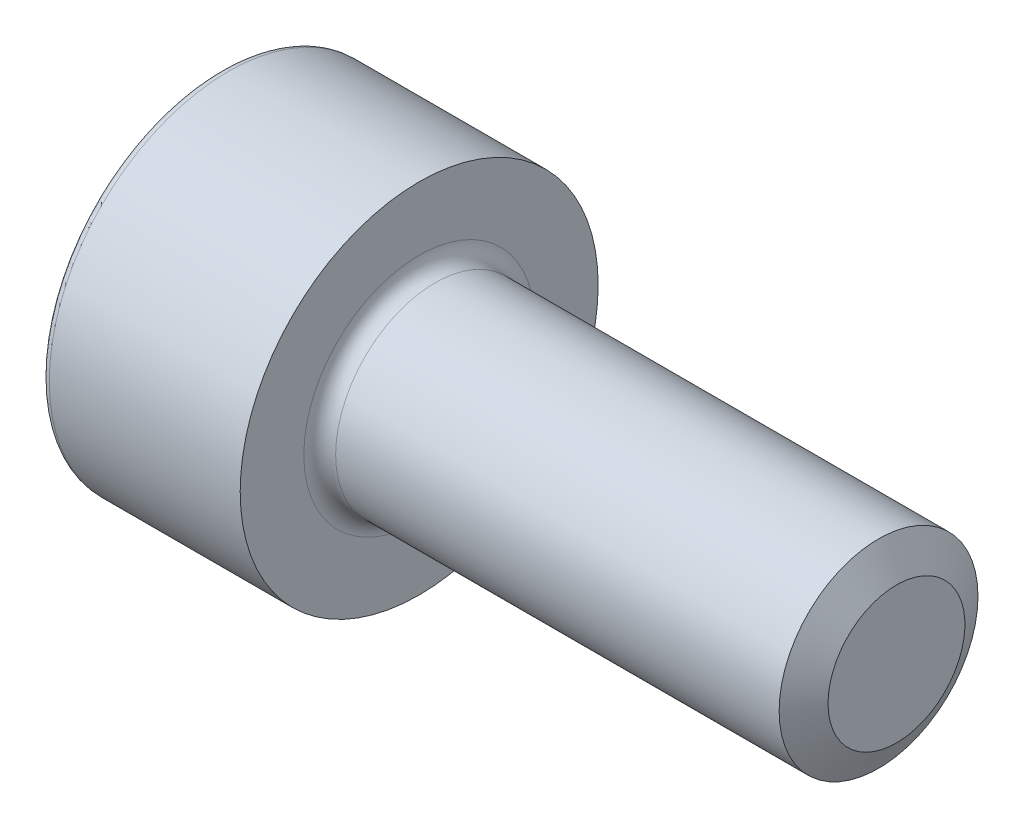
ISO-10303-21;
HEADER;
FILE_DESCRIPTION(('STEP AP214'),'2;1');
FILE_NAME('part.step','',(''),(''),'','','');
FILE_SCHEMA(('AUTOMOTIVE_DESIGN { 1 0 10303 214 1 1 1 1 }'));
ENDSEC;
DATA;
#1=APPLICATION_CONTEXT('core data for automotive mechanical design processes');
#2=APPLICATION_PROTOCOL_DEFINITION('international standard','automotive_design',2000,#1);
#3=PRODUCT_CONTEXT('',#1,'mechanical');
#4=PRODUCT('Part','Part','',(#3));
#5=PRODUCT_RELATED_PRODUCT_CATEGORY('part','',(#4));
#6=PRODUCT_DEFINITION_FORMATION('','',#4);
#7=PRODUCT_DEFINITION_CONTEXT('part definition',#1,'design');
#8=PRODUCT_DEFINITION('design','',#6,#7);
#9=PRODUCT_DEFINITION_SHAPE('','',#8);
#10=(LENGTH_UNIT() NAMED_UNIT(*) SI_UNIT(.MILLI.,.METRE.));
#11=(NAMED_UNIT(*) PLANE_ANGLE_UNIT() SI_UNIT($,.RADIAN.));
#12=(NAMED_UNIT(*) SI_UNIT($,.STERADIAN.) SOLID_ANGLE_UNIT());
#13=UNCERTAINTY_MEASURE_WITH_UNIT(LENGTH_MEASURE(1.E-05),#10,'distance_accuracy_value','');
#14=(GEOMETRIC_REPRESENTATION_CONTEXT(3) GLOBAL_UNCERTAINTY_ASSIGNED_CONTEXT((#13)) GLOBAL_UNIT_ASSIGNED_CONTEXT((#10,
#11,#12)) REPRESENTATION_CONTEXT('',''));
#15=CARTESIAN_POINT('',(0.,0.,0.));
#16=DIRECTION('',(0.,0.,1.));
#17=DIRECTION('',(1.,0.,0.));
#18=AXIS2_PLACEMENT_3D('',#15,#16,#17);
#19=CARTESIAN_POINT('',(0.,0.,0.));
#20=DIRECTION('',(-1.,0.,0.));
#21=DIRECTION('',(0.,0.,1.));
#22=AXIS2_PLACEMENT_3D('',#19,#20,#21);
#23=CYLINDRICAL_SURFACE('',#22,1.25);
#24=CARTESIAN_POINT('',(2.7,0.,0.));
#25=DIRECTION('',(-1.,0.,0.));
#26=DIRECTION('',(0.,0.,1.));
#27=AXIS2_PLACEMENT_3D('',#24,#25,#26);
#28=CIRCLE('',#27,1.25);
#29=CARTESIAN_POINT('',(2.7,0.,1.25));
#30=VERTEX_POINT('',#29);
#31=EDGE_CURVE('E144',#30,#30,#28,.T.);
#32=ORIENTED_EDGE('',*,*,#31,.F.);
#33=EDGE_LOOP('',(#32));
#34=FACE_BOUND('',#33,.T.);
#35=CARTESIAN_POINT('',(8.2750066000968,0.,0.));
#36=DIRECTION('',(-1.,0.,0.));
#37=DIRECTION('',(0.,0.,1.));
#38=AXIS2_PLACEMENT_3D('',#35,#36,#37);
#39=CIRCLE('',#38,1.25);
#40=CARTESIAN_POINT('',(8.2750066000968,0.,1.25));
#41=VERTEX_POINT('',#40);
#42=EDGE_CURVE('E281',#41,#41,#39,.T.);
#43=ORIENTED_EDGE('',*,*,#42,.T.);
#44=EDGE_LOOP('',(#43));
#45=FACE_BOUND('',#44,.T.);
#46=ADVANCED_FACE('F41',(#34,#45),#23,.T.);
#47=CARTESIAN_POINT('',(0.,0.,0.));
#48=DIRECTION('',(1.,0.,0.));
#49=DIRECTION('',(0.,0.,-1.));
#50=AXIS2_PLACEMENT_3D('',#47,#48,#49);
#51=PLANE('',#50);
#52=CARTESIAN_POINT('',(0.,0.,0.));
#53=DIRECTION('',(1.,0.,0.));
#54=DIRECTION('',(0.,0.,-1.));
#55=AXIS2_PLACEMENT_3D('',#52,#53,#54);
#56=CIRCLE('',#55,2.15);
#57=CARTESIAN_POINT('',(0.,0.,-2.15));
#58=VERTEX_POINT('',#57);
#59=EDGE_CURVE('E49',#58,#58,#56,.F.);
#60=ORIENTED_EDGE('',*,*,#59,.T.);
#61=EDGE_LOOP('',(#60));
#62=FACE_BOUND('',#61,.T.);
#63=DIRECTION('',(0.,0.866025403784439,-0.5));
#64=VECTOR('',#63,1.);
#65=CARTESIAN_POINT('',(0.,0.,1.15));
#66=LINE('',#65,#64);
#67=CARTESIAN_POINT('',(0.,0.,1.15));
#68=VERTEX_POINT('',#67);
#69=CARTESIAN_POINT('',(0.,0.995929214352105,0.575));
#70=VERTEX_POINT('',#69);
#71=EDGE_CURVE('E130',#68,#70,#66,.T.);
#72=ORIENTED_EDGE('',*,*,#71,.F.);
#73=DIRECTION('',(0.,0.866025403784439,0.5));
#74=VECTOR('',#73,1.);
#75=CARTESIAN_POINT('',(0.,-0.995929214352105,0.575));
#76=LINE('',#75,#74);
#77=CARTESIAN_POINT('',(0.,-0.995929214352105,0.575));
#78=VERTEX_POINT('',#77);
#79=EDGE_CURVE('E56',#78,#68,#76,.T.);
#80=ORIENTED_EDGE('',*,*,#79,.F.);
#81=DIRECTION('',(0.,0.,1.));
#82=VECTOR('',#81,1.);
#83=CARTESIAN_POINT('',(0.,-0.995929214352105,-0.575));
#84=LINE('',#83,#82);
#85=CARTESIAN_POINT('',(0.,-0.995929214352105,-0.575));
#86=VERTEX_POINT('',#85);
#87=EDGE_CURVE('E140',#86,#78,#84,.T.);
#88=ORIENTED_EDGE('',*,*,#87,.F.);
#89=DIRECTION('',(0.,-0.866025403784439,0.5));
#90=VECTOR('',#89,1.);
#91=CARTESIAN_POINT('',(0.,0.,-1.15));
#92=LINE('',#91,#90);
#93=CARTESIAN_POINT('',(0.,0.,-1.15));
#94=VERTEX_POINT('',#93);
#95=EDGE_CURVE('E138',#94,#86,#92,.T.);
#96=ORIENTED_EDGE('',*,*,#95,.F.);
#97=DIRECTION('',(0.,-0.866025403784439,-0.5));
#98=VECTOR('',#97,1.);
#99=CARTESIAN_POINT('',(0.,0.995929214352105,-0.575));
#100=LINE('',#99,#98);
#101=CARTESIAN_POINT('',(0.,0.995929214352105,-0.575));
#102=VERTEX_POINT('',#101);
#103=EDGE_CURVE('E104',#102,#94,#100,.T.);
#104=ORIENTED_EDGE('',*,*,#103,.F.);
#105=DIRECTION('',(0.,0.,-1.));
#106=VECTOR('',#105,1.);
#107=CARTESIAN_POINT('',(0.,0.995929214352105,0.575));
#108=LINE('',#107,#106);
#109=EDGE_CURVE('E134',#70,#102,#108,.T.);
#110=ORIENTED_EDGE('',*,*,#109,.F.);
#111=EDGE_LOOP('',(#72,#80,#88,#96,#104,#110));
#112=FACE_BOUND('',#111,.T.);
#113=ADVANCED_FACE('F161',(#62,#112),#51,.F.);
#114=CARTESIAN_POINT('',(0.,0.,0.));
#115=DIRECTION('',(-1.,0.,0.));
#116=DIRECTION('',(0.,0.,1.));
#117=AXIS2_PLACEMENT_3D('',#114,#115,#116);
#118=CYLINDRICAL_SURFACE('',#117,2.25);
#119=CARTESIAN_POINT('',(0.1,0.,0.));
#120=DIRECTION('',(1.,0.,0.));
#121=DIRECTION('',(0.,0.,-1.));
#122=AXIS2_PLACEMENT_3D('',#119,#120,#121);
#123=CIRCLE('',#122,2.25);
#124=CARTESIAN_POINT('',(0.1,0.,-2.25));
#125=VERTEX_POINT('',#124);
#126=EDGE_CURVE('E11',#125,#125,#123,.T.);
#127=ORIENTED_EDGE('',*,*,#126,.T.);
#128=EDGE_LOOP('',(#127));
#129=FACE_BOUND('',#128,.T.);
#130=CARTESIAN_POINT('',(2.5,0.,0.));
#131=DIRECTION('',(-1.,0.,0.));
#132=DIRECTION('',(0.,0.,1.));
#133=AXIS2_PLACEMENT_3D('',#130,#131,#132);
#134=CIRCLE('',#133,2.25);
#135=CARTESIAN_POINT('',(2.5,0.,2.25));
#136=VERTEX_POINT('',#135);
#137=EDGE_CURVE('E155',#136,#136,#134,.T.);
#138=ORIENTED_EDGE('',*,*,#137,.T.);
#139=EDGE_LOOP('',(#138));
#140=FACE_BOUND('',#139,.T.);
#141=ADVANCED_FACE('F180',(#129,#140),#118,.T.);
#142=CARTESIAN_POINT('',(2.5,2.25,0.));
#143=DIRECTION('',(-1.,0.,0.));
#144=DIRECTION('',(0.,0.,1.));
#145=AXIS2_PLACEMENT_3D('',#142,#143,#144);
#146=PLANE('',#145);
#147=ORIENTED_EDGE('',*,*,#137,.F.);
#148=EDGE_LOOP('',(#147));
#149=FACE_BOUND('',#148,.T.);
#150=CARTESIAN_POINT('',(2.5,0.,0.));
#151=DIRECTION('',(-1.,0.,0.));
#152=DIRECTION('',(0.,0.,1.));
#153=AXIS2_PLACEMENT_3D('',#150,#151,#152);
#154=CIRCLE('',#153,1.45);
#155=CARTESIAN_POINT('',(2.5,0.,1.45));
#156=VERTEX_POINT('',#155);
#157=EDGE_CURVE('E152',#156,#156,#154,.T.);
#158=ORIENTED_EDGE('',*,*,#157,.T.);
#159=EDGE_LOOP('',(#158));
#160=FACE_BOUND('',#159,.T.);
#161=ADVANCED_FACE('F189',(#149,#160),#146,.F.);
#162=CARTESIAN_POINT('',(2.7,0.,0.));
#163=DIRECTION('',(-1.,0.,0.));
#164=DIRECTION('',(0.,0.,1.));
#165=AXIS2_PLACEMENT_3D('',#162,#163,#164);
#166=TOROIDAL_SURFACE('',#165,1.45,0.2);
#167=ORIENTED_EDGE('',*,*,#157,.F.);
#168=EDGE_LOOP('',(#167));
#169=FACE_BOUND('',#168,.T.);
#170=ORIENTED_EDGE('',*,*,#31,.T.);
#171=EDGE_LOOP('',(#170));
#172=FACE_BOUND('',#171,.T.);
#173=ADVANCED_FACE('F185',(#169,#172),#166,.F.);
#174=CARTESIAN_POINT('',(1.1,-0.995929214352105,0.575));
#175=DIRECTION('',(0.,-0.5,0.866025403784439));
#176=DIRECTION('',(0.,-0.866025403784439,-0.5));
#177=AXIS2_PLACEMENT_3D('',#174,#175,#176);
#178=PLANE('',#177);
#179=ORIENTED_EDGE('',*,*,#79,.T.);
#180=DIRECTION('',(-1.,0.,0.));
#181=VECTOR('',#180,1.);
#182=CARTESIAN_POINT('',(1.1,0.,1.15));
#183=LINE('',#182,#181);
#184=CARTESIAN_POINT('',(1.1,0.,1.15));
#185=VERTEX_POINT('',#184);
#186=EDGE_CURVE('E86',#185,#68,#183,.T.);
#187=ORIENTED_EDGE('',*,*,#186,.F.);
#188=DIRECTION('',(0.,0.866025403784439,0.5));
#189=VECTOR('',#188,1.);
#190=CARTESIAN_POINT('',(1.1,-0.995929214352105,0.575));
#191=LINE('',#190,#189);
#192=CARTESIAN_POINT('',(1.1,-0.995929214352105,0.575));
#193=VERTEX_POINT('',#192);
#194=EDGE_CURVE('E142',#193,#185,#191,.T.);
#195=ORIENTED_EDGE('',*,*,#194,.F.);
#196=DIRECTION('',(-1.,0.,0.));
#197=VECTOR('',#196,1.);
#198=CARTESIAN_POINT('',(1.1,-0.995929214352105,0.575));
#199=LINE('',#198,#197);
#200=EDGE_CURVE('E64',#193,#78,#199,.T.);
#201=ORIENTED_EDGE('',*,*,#200,.T.);
#202=EDGE_LOOP('',(#179,#187,#195,#201));
#203=FACE_BOUND('',#202,.T.);
#204=ADVANCED_FACE('F188',(#203),#178,.F.);
#205=CARTESIAN_POINT('',(1.1,-0.995929214352105,-0.575));
#206=DIRECTION('',(0.,-1.,0.));
#207=DIRECTION('',(0.,0.,-1.));
#208=AXIS2_PLACEMENT_3D('',#205,#206,#207);
#209=PLANE('',#208);
#210=ORIENTED_EDGE('',*,*,#87,.T.);
#211=ORIENTED_EDGE('',*,*,#200,.F.);
#212=DIRECTION('',(0.,0.,1.));
#213=VECTOR('',#212,1.);
#214=CARTESIAN_POINT('',(1.1,-0.995929214352105,-0.575));
#215=LINE('',#214,#213);
#216=CARTESIAN_POINT('',(1.1,-0.995929214352105,-0.575));
#217=VERTEX_POINT('',#216);
#218=EDGE_CURVE('E116',#217,#193,#215,.T.);
#219=ORIENTED_EDGE('',*,*,#218,.F.);
#220=DIRECTION('',(-1.,0.,0.));
#221=VECTOR('',#220,1.);
#222=CARTESIAN_POINT('',(1.1,-0.995929214352105,-0.575));
#223=LINE('',#222,#221);
#224=EDGE_CURVE('E108',#217,#86,#223,.T.);
#225=ORIENTED_EDGE('',*,*,#224,.T.);
#226=EDGE_LOOP('',(#210,#211,#219,#225));
#227=FACE_BOUND('',#226,.T.);
#228=ADVANCED_FACE('F219',(#227),#209,.F.);
#229=CARTESIAN_POINT('',(1.1,0.,-1.15));
#230=DIRECTION('',(0.,-0.5,-0.866025403784439));
#231=DIRECTION('',(0.,0.866025403784439,-0.5));
#232=AXIS2_PLACEMENT_3D('',#229,#230,#231);
#233=PLANE('',#232);
#234=ORIENTED_EDGE('',*,*,#95,.T.);
#235=ORIENTED_EDGE('',*,*,#224,.F.);
#236=DIRECTION('',(0.,-0.866025403784439,0.5));
#237=VECTOR('',#236,1.);
#238=CARTESIAN_POINT('',(1.1,0.,-1.15));
#239=LINE('',#238,#237);
#240=CARTESIAN_POINT('',(1.1,0.,-1.15));
#241=VERTEX_POINT('',#240);
#242=EDGE_CURVE('E112',#241,#217,#239,.T.);
#243=ORIENTED_EDGE('',*,*,#242,.F.);
#244=DIRECTION('',(-1.,0.,0.));
#245=VECTOR('',#244,1.);
#246=CARTESIAN_POINT('',(1.1,0.,-1.15));
#247=LINE('',#246,#245);
#248=EDGE_CURVE('E97',#241,#94,#247,.T.);
#249=ORIENTED_EDGE('',*,*,#248,.T.);
#250=EDGE_LOOP('',(#234,#235,#243,#249));
#251=FACE_BOUND('',#250,.T.);
#252=ADVANCED_FACE('F113',(#251),#233,.F.);
#253=CARTESIAN_POINT('',(1.1,0.995929214352105,-0.575));
#254=DIRECTION('',(0.,0.5,-0.866025403784439));
#255=DIRECTION('',(0.,0.866025403784439,0.5));
#256=AXIS2_PLACEMENT_3D('',#253,#254,#255);
#257=PLANE('',#256);
#258=ORIENTED_EDGE('',*,*,#103,.T.);
#259=ORIENTED_EDGE('',*,*,#248,.F.);
#260=DIRECTION('',(0.,-0.866025403784439,-0.5));
#261=VECTOR('',#260,1.);
#262=CARTESIAN_POINT('',(1.1,0.995929214352105,-0.575));
#263=LINE('',#262,#261);
#264=CARTESIAN_POINT('',(1.1,0.995929214352105,-0.575));
#265=VERTEX_POINT('',#264);
#266=EDGE_CURVE('E101',#265,#241,#263,.T.);
#267=ORIENTED_EDGE('',*,*,#266,.F.);
#268=DIRECTION('',(-1.,0.,0.));
#269=VECTOR('',#268,1.);
#270=CARTESIAN_POINT('',(1.1,0.995929214352105,-0.575));
#271=LINE('',#270,#269);
#272=EDGE_CURVE('E109',#265,#102,#271,.T.);
#273=ORIENTED_EDGE('',*,*,#272,.T.);
#274=EDGE_LOOP('',(#258,#259,#267,#273));
#275=FACE_BOUND('',#274,.T.);
#276=ADVANCED_FACE('F99',(#275),#257,.F.);
#277=CARTESIAN_POINT('',(1.1,0.995929214352105,0.575));
#278=DIRECTION('',(0.,1.,0.));
#279=DIRECTION('',(0.,0.,1.));
#280=AXIS2_PLACEMENT_3D('',#277,#278,#279);
#281=PLANE('',#280);
#282=ORIENTED_EDGE('',*,*,#109,.T.);
#283=ORIENTED_EDGE('',*,*,#272,.F.);
#284=DIRECTION('',(0.,0.,-1.));
#285=VECTOR('',#284,1.);
#286=CARTESIAN_POINT('',(1.1,0.995929214352105,0.575));
#287=LINE('',#286,#285);
#288=CARTESIAN_POINT('',(1.1,0.995929214352105,0.575));
#289=VERTEX_POINT('',#288);
#290=EDGE_CURVE('E122',#289,#265,#287,.T.);
#291=ORIENTED_EDGE('',*,*,#290,.F.);
#292=DIRECTION('',(-1.,0.,0.));
#293=VECTOR('',#292,1.);
#294=CARTESIAN_POINT('',(1.1,0.995929214352105,0.575));
#295=LINE('',#294,#293);
#296=EDGE_CURVE('E147',#289,#70,#295,.T.);
#297=ORIENTED_EDGE('',*,*,#296,.T.);
#298=EDGE_LOOP('',(#282,#283,#291,#297));
#299=FACE_BOUND('',#298,.T.);
#300=ADVANCED_FACE('F237',(#299),#281,.F.);
#301=CARTESIAN_POINT('',(1.1,0.,1.15));
#302=DIRECTION('',(0.,0.5,0.866025403784438));
#303=DIRECTION('',(0.,-0.866025403784439,0.5));
#304=AXIS2_PLACEMENT_3D('',#301,#302,#303);
#305=PLANE('',#304);
#306=ORIENTED_EDGE('',*,*,#71,.T.);
#307=ORIENTED_EDGE('',*,*,#296,.F.);
#308=DIRECTION('',(0.,0.866025403784439,-0.5));
#309=VECTOR('',#308,1.);
#310=CARTESIAN_POINT('',(1.1,0.,1.15));
#311=LINE('',#310,#309);
#312=EDGE_CURVE('E124',#185,#289,#311,.T.);
#313=ORIENTED_EDGE('',*,*,#312,.F.);
#314=ORIENTED_EDGE('',*,*,#186,.T.);
#315=EDGE_LOOP('',(#306,#307,#313,#314));
#316=FACE_BOUND('',#315,.T.);
#317=ADVANCED_FACE('F244',(#316),#305,.F.);
#318=CARTESIAN_POINT('',(1.1,-0.995929214352105,0.574999999999999));
#319=DIRECTION('',(1.,0.,0.));
#320=DIRECTION('',(0.,0.,-1.));
#321=AXIS2_PLACEMENT_3D('',#318,#319,#320);
#322=PLANE('',#321);
#323=ORIENTED_EDGE('',*,*,#194,.T.);
#324=ORIENTED_EDGE('',*,*,#312,.T.);
#325=ORIENTED_EDGE('',*,*,#290,.T.);
#326=ORIENTED_EDGE('',*,*,#266,.T.);
#327=ORIENTED_EDGE('',*,*,#242,.T.);
#328=ORIENTED_EDGE('',*,*,#218,.T.);
#329=EDGE_LOOP('',(#323,#324,#325,#326,#327,#328));
#330=FACE_BOUND('',#329,.T.);
#331=ADVANCED_FACE('F119',(#330),#322,.F.);
#332=CARTESIAN_POINT('',(8.2750066000968,0.,0.));
#333=DIRECTION('',(-1.,0.,0.));
#334=DIRECTION('',(0.,0.,1.));
#335=AXIS2_PLACEMENT_3D('',#332,#333,#334);
#336=CONICAL_SURFACE('',#335,1.25,1.04719755119659);
#337=CARTESIAN_POINT('',(8.5,0.,0.));
#338=DIRECTION('',(-1.,0.,0.));
#339=DIRECTION('',(0.,0.,1.));
#340=AXIS2_PLACEMENT_3D('',#337,#338,#339);
#341=CIRCLE('',#340,0.8603);
#342=CARTESIAN_POINT('',(8.5,0.,0.8603));
#343=VERTEX_POINT('',#342);
#344=EDGE_CURVE('E131',#343,#343,#341,.T.);
#345=ORIENTED_EDGE('',*,*,#344,.T.);
#346=EDGE_LOOP('',(#345));
#347=FACE_BOUND('',#346,.T.);
#348=ORIENTED_EDGE('',*,*,#42,.F.);
#349=EDGE_LOOP('',(#348));
#350=FACE_BOUND('',#349,.T.);
#351=ADVANCED_FACE('F170',(#347,#350),#336,.T.);
#352=CARTESIAN_POINT('',(8.5,1.25,0.));
#353=DIRECTION('',(-1.,0.,0.));
#354=DIRECTION('',(0.,0.,1.));
#355=AXIS2_PLACEMENT_3D('',#352,#353,#354);
#356=PLANE('',#355);
#357=ORIENTED_EDGE('',*,*,#344,.F.);
#358=EDGE_LOOP('',(#357));
#359=FACE_BOUND('',#358,.T.);
#360=ADVANCED_FACE('F165',(#359),#356,.F.);
#361=CARTESIAN_POINT('',(0.1,0.,0.));
#362=DIRECTION('',(1.,0.,0.));
#363=DIRECTION('',(0.,0.,-1.));
#364=AXIS2_PLACEMENT_3D('',#361,#362,#363);
#365=TOROIDAL_SURFACE('',#364,2.15,0.1);
#366=ORIENTED_EDGE('',*,*,#126,.F.);
#367=EDGE_LOOP('',(#366));
#368=FACE_BOUND('',#367,.T.);
#369=ORIENTED_EDGE('',*,*,#59,.F.);
#370=EDGE_LOOP('',(#369));
#371=FACE_BOUND('',#370,.T.);
#372=ADVANCED_FACE('F43',(#368,#371),#365,.T.);
#373=CLOSED_SHELL('',(#46,#113,#141,#161,#173,#204,#228,#252,#276,#300,#317,#331,#351,#360,#372));
#374=MANIFOLD_SOLID_BREP('B2',#373);
#375=ADVANCED_BREP_SHAPE_REPRESENTATION('',(#18,#374),#14);
#376=SHAPE_DEFINITION_REPRESENTATION(#9,#375);
ENDSEC;
END-ISO-10303-21;
